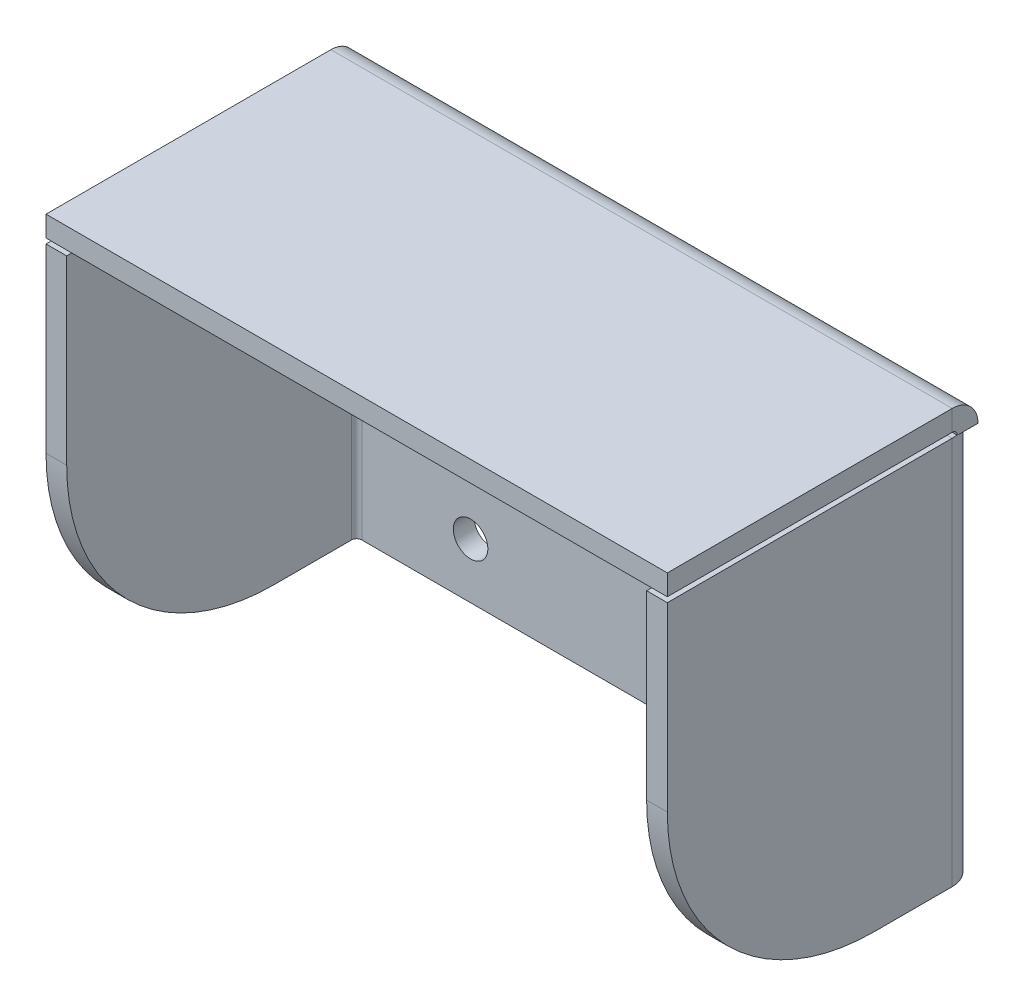
ISO-10303-21;
HEADER;
FILE_DESCRIPTION(('STEP AP214'),'2;1');
FILE_NAME('part.step','',(''),(''),'','','');
FILE_SCHEMA(('AUTOMOTIVE_DESIGN { 1 0 10303 214 1 1 1 1 }'));
ENDSEC;
DATA;
#1=APPLICATION_CONTEXT('core data for automotive mechanical design processes');
#2=APPLICATION_PROTOCOL_DEFINITION('international standard','automotive_design',2000,#1);
#3=PRODUCT_CONTEXT('',#1,'mechanical');
#4=PRODUCT('Part','Part','',(#3));
#5=PRODUCT_RELATED_PRODUCT_CATEGORY('part','',(#4));
#6=PRODUCT_DEFINITION_FORMATION('','',#4);
#7=PRODUCT_DEFINITION_CONTEXT('part definition',#1,'design');
#8=PRODUCT_DEFINITION('design','',#6,#7);
#9=PRODUCT_DEFINITION_SHAPE('','',#8);
#10=(LENGTH_UNIT() NAMED_UNIT(*) SI_UNIT(.MILLI.,.METRE.));
#11=(NAMED_UNIT(*) PLANE_ANGLE_UNIT() SI_UNIT($,.RADIAN.));
#12=(NAMED_UNIT(*) SI_UNIT($,.STERADIAN.) SOLID_ANGLE_UNIT());
#13=UNCERTAINTY_MEASURE_WITH_UNIT(LENGTH_MEASURE(1.E-05),#10,'distance_accuracy_value','');
#14=(GEOMETRIC_REPRESENTATION_CONTEXT(3) GLOBAL_UNCERTAINTY_ASSIGNED_CONTEXT((#13)) GLOBAL_UNIT_ASSIGNED_CONTEXT((#10,
#11,#12)) REPRESENTATION_CONTEXT('',''));
#15=CARTESIAN_POINT('',(0.,0.,0.));
#16=DIRECTION('',(0.,0.,1.));
#17=DIRECTION('',(1.,0.,0.));
#18=AXIS2_PLACEMENT_3D('',#15,#16,#17);
#19=CARTESIAN_POINT('',(45.,26.2634,0.));
#20=DIRECTION('',(0.,-1.,0.));
#21=DIRECTION('',(0.,0.,-1.));
#22=AXIS2_PLACEMENT_3D('',#19,#20,#21);
#23=PLANE('',#22);
#24=DIRECTION('',(-1.,0.,0.));
#25=VECTOR('',#24,1.);
#26=CARTESIAN_POINT('',(45.,26.2634,0.));
#27=LINE('',#26,#25);
#28=CARTESIAN_POINT('',(45.,26.2634,0.));
#29=VERTEX_POINT('',#28);
#30=CARTESIAN_POINT('',(44.926677221287,26.2634,0.));
#31=VERTEX_POINT('',#30);
#32=EDGE_CURVE('E357',#29,#31,#27,.T.);
#33=ORIENTED_EDGE('',*,*,#32,.T.);
#34=CARTESIAN_POINT('',(41.2634,26.2634,0.736599999999992));
#35=DIRECTION('',(0.,1.,0.));
#36=DIRECTION('',(0.,0.,1.));
#37=AXIS2_PLACEMENT_3D('',#34,#35,#36);
#38=CIRCLE('',#37,3.7366);
#39=CARTESIAN_POINT('',(41.2634,26.2634,-3.));
#40=VERTEX_POINT('',#39);
#41=EDGE_CURVE('E296',#31,#40,#38,.T.);
#42=ORIENTED_EDGE('',*,*,#41,.T.);
#43=DIRECTION('',(-1.,0.,0.));
#44=VECTOR('',#43,1.);
#45=CARTESIAN_POINT('',(-45.,26.2634000000001,-3.));
#46=LINE('',#45,#44);
#47=CARTESIAN_POINT('',(45.,26.2634,-3.));
#48=VERTEX_POINT('',#47);
#49=EDGE_CURVE('E360',#48,#40,#46,.T.);
#50=ORIENTED_EDGE('',*,*,#49,.F.);
#51=DIRECTION('',(0.,0.,-1.));
#52=VECTOR('',#51,1.);
#53=CARTESIAN_POINT('',(45.,26.2634,0.));
#54=LINE('',#53,#52);
#55=EDGE_CURVE('E415',#29,#48,#54,.T.);
#56=ORIENTED_EDGE('',*,*,#55,.F.);
#57=EDGE_LOOP('',(#33,#42,#50,#56));
#58=FACE_BOUND('',#57,.T.);
#59=ADVANCED_FACE('F99',(#58),#23,.T.);
#60=CARTESIAN_POINT('',(-41.2634,26.2634,0.));
#61=DIRECTION('',(0.,-1.,0.));
#62=DIRECTION('',(0.,0.,-1.));
#63=AXIS2_PLACEMENT_3D('',#60,#61,#62);
#64=PLANE('',#63);
#65=DIRECTION('',(-1.,0.,0.));
#66=VECTOR('',#65,1.);
#67=CARTESIAN_POINT('',(-45.,26.2634,-3.));
#68=LINE('',#67,#66);
#69=CARTESIAN_POINT('',(-45.,26.2634,-2.99999999999999));
#70=VERTEX_POINT('',#69);
#71=CARTESIAN_POINT('',(-41.2634,26.2634,-2.99999999999998));
#72=VERTEX_POINT('',#71);
#73=EDGE_CURVE('E394',#70,#72,#68,.F.);
#74=ORIENTED_EDGE('',*,*,#73,.T.);
#75=CARTESIAN_POINT('',(-41.2634,26.2634,0.736600000000007));
#76=DIRECTION('',(0.,-1.,0.));
#77=DIRECTION('',(0.,0.,-1.));
#78=AXIS2_PLACEMENT_3D('',#75,#76,#77);
#79=CIRCLE('',#78,3.73659999999999);
#80=CARTESIAN_POINT('',(-44.9266772212869,26.2634,0.));
#81=VERTEX_POINT('',#80);
#82=EDGE_CURVE('E340',#72,#81,#79,.F.);
#83=ORIENTED_EDGE('',*,*,#82,.T.);
#84=DIRECTION('',(-1.,0.,0.));
#85=VECTOR('',#84,1.);
#86=CARTESIAN_POINT('',(-45.,26.2634,0.));
#87=LINE('',#86,#85);
#88=CARTESIAN_POINT('',(-45.,26.2634,0.));
#89=VERTEX_POINT('',#88);
#90=EDGE_CURVE('E408',#89,#81,#87,.F.);
#91=ORIENTED_EDGE('',*,*,#90,.F.);
#92=DIRECTION('',(0.,0.,-1.));
#93=VECTOR('',#92,1.);
#94=CARTESIAN_POINT('',(-45.,26.2634,0.));
#95=LINE('',#94,#93);
#96=EDGE_CURVE('E401',#89,#70,#95,.T.);
#97=ORIENTED_EDGE('',*,*,#96,.T.);
#98=EDGE_LOOP('',(#74,#83,#91,#97));
#99=FACE_BOUND('',#98,.T.);
#100=ADVANCED_FACE('F468',(#99),#64,.T.);
#101=CARTESIAN_POINT('',(0.,0.,-3.));
#102=DIRECTION('',(0.,0.,-1.));
#103=DIRECTION('',(-1.,0.,0.));
#104=AXIS2_PLACEMENT_3D('',#101,#102,#103);
#105=PLANE('',#104);
#106=CARTESIAN_POINT('',(25.5000000000031,13.9999999999997,-3.));
#107=DIRECTION('',(0.,0.,-1.));
#108=DIRECTION('',(-1.,0.,0.));
#109=AXIS2_PLACEMENT_3D('',#106,#107,#108);
#110=CIRCLE('',#109,2.49999999999999);
#111=CARTESIAN_POINT('',(23.0000000000031,13.9999999999997,-3.));
#112=VERTEX_POINT('',#111);
#113=EDGE_CURVE('E432',#112,#112,#110,.T.);
#114=ORIENTED_EDGE('',*,*,#113,.F.);
#115=EDGE_LOOP('',(#114));
#116=FACE_BOUND('',#115,.T.);
#117=CARTESIAN_POINT('',(25.5000000000031,-22.0000000000003,-3.));
#118=DIRECTION('',(0.,0.,-1.));
#119=DIRECTION('',(-1.,0.,0.));
#120=AXIS2_PLACEMENT_3D('',#117,#118,#119);
#121=CIRCLE('',#120,2.49999999999999);
#122=CARTESIAN_POINT('',(23.0000000000031,-22.0000000000003,-3.));
#123=VERTEX_POINT('',#122);
#124=EDGE_CURVE('E431',#123,#123,#121,.T.);
#125=ORIENTED_EDGE('',*,*,#124,.F.);
#126=EDGE_LOOP('',(#125));
#127=FACE_BOUND('',#126,.T.);
#128=CARTESIAN_POINT('',(-25.4999999999969,-22.0000000000003,-3.));
#129=DIRECTION('',(0.,0.,-1.));
#130=DIRECTION('',(-1.,0.,0.));
#131=AXIS2_PLACEMENT_3D('',#128,#129,#130);
#132=CIRCLE('',#131,2.49999999999999);
#133=CARTESIAN_POINT('',(-27.9999999999969,-22.0000000000003,-3.));
#134=VERTEX_POINT('',#133);
#135=EDGE_CURVE('E961',#134,#134,#132,.T.);
#136=ORIENTED_EDGE('',*,*,#135,.F.);
#137=EDGE_LOOP('',(#136));
#138=FACE_BOUND('',#137,.T.);
#139=CARTESIAN_POINT('',(-25.4999999999969,13.9999999999997,-3.));
#140=DIRECTION('',(0.,0.,-1.));
#141=DIRECTION('',(-1.,0.,0.));
#142=AXIS2_PLACEMENT_3D('',#139,#140,#141);
#143=CIRCLE('',#142,2.49999999999999);
#144=CARTESIAN_POINT('',(-27.9999999999969,13.9999999999997,-3.));
#145=VERTEX_POINT('',#144);
#146=EDGE_CURVE('E427',#145,#145,#143,.T.);
#147=ORIENTED_EDGE('',*,*,#146,.F.);
#148=EDGE_LOOP('',(#147));
#149=FACE_BOUND('',#148,.T.);
#150=EDGE_CURVE('E398',#72,#40,#68,.F.);
#151=ORIENTED_EDGE('',*,*,#150,.T.);
#152=DIRECTION('',(0.,1.,0.));
#153=VECTOR('',#152,1.);
#154=CARTESIAN_POINT('',(41.2634,26.2634,-3.00000000000001));
#155=LINE('',#154,#153);
#156=CARTESIAN_POINT('',(41.2634,-30.,-3.));
#157=VERTEX_POINT('',#156);
#158=EDGE_CURVE('E286',#40,#157,#155,.F.);
#159=ORIENTED_EDGE('',*,*,#158,.T.);
#160=DIRECTION('',(1.,0.,0.));
#161=VECTOR('',#160,1.);
#162=CARTESIAN_POINT('',(-45.,-30.,-3.));
#163=LINE('',#162,#161);
#164=CARTESIAN_POINT('',(-41.2634,-30.,-2.99999999999999));
#165=VERTEX_POINT('',#164);
#166=EDGE_CURVE('E420',#165,#157,#163,.T.);
#167=ORIENTED_EDGE('',*,*,#166,.F.);
#168=DIRECTION('',(0.,-1.,0.));
#169=VECTOR('',#168,1.);
#170=CARTESIAN_POINT('',(-41.2634,-30.,-2.99999999999999));
#171=LINE('',#170,#169);
#172=EDGE_CURVE('E335',#165,#72,#171,.F.);
#173=ORIENTED_EDGE('',*,*,#172,.T.);
#174=EDGE_LOOP('',(#151,#159,#167,#173));
#175=FACE_BOUND('',#174,.T.);
#176=ADVANCED_FACE('F474',(#116,#127,#138,#149,#175),#105,.T.);
#177=CARTESIAN_POINT('',(0.,0.,0.));
#178=DIRECTION('',(0.,0.,-1.));
#179=DIRECTION('',(-1.,0.,0.));
#180=AXIS2_PLACEMENT_3D('',#177,#178,#179);
#181=PLANE('',#180);
#182=CARTESIAN_POINT('',(25.5000000000031,13.9999999999997,0.));
#183=DIRECTION('',(0.,0.,-1.));
#184=DIRECTION('',(-1.,0.,0.));
#185=AXIS2_PLACEMENT_3D('',#182,#183,#184);
#186=CIRCLE('',#185,2.49999999999999);
#187=CARTESIAN_POINT('',(23.0000000000031,13.9999999999997,0.));
#188=VERTEX_POINT('',#187);
#189=EDGE_CURVE('E428',#188,#188,#186,.T.);
#190=ORIENTED_EDGE('',*,*,#189,.T.);
#191=EDGE_LOOP('',(#190));
#192=FACE_BOUND('',#191,.T.);
#193=CARTESIAN_POINT('',(25.5000000000031,-22.0000000000003,0.));
#194=DIRECTION('',(0.,0.,-1.));
#195=DIRECTION('',(-1.,0.,0.));
#196=AXIS2_PLACEMENT_3D('',#193,#194,#195);
#197=CIRCLE('',#196,2.49999999999999);
#198=CARTESIAN_POINT('',(23.0000000000031,-22.0000000000003,0.));
#199=VERTEX_POINT('',#198);
#200=EDGE_CURVE('E953',#199,#199,#197,.T.);
#201=ORIENTED_EDGE('',*,*,#200,.T.);
#202=EDGE_LOOP('',(#201));
#203=FACE_BOUND('',#202,.T.);
#204=CARTESIAN_POINT('',(-25.4999999999969,-22.0000000000003,0.));
#205=DIRECTION('',(0.,0.,-1.));
#206=DIRECTION('',(-1.,0.,0.));
#207=AXIS2_PLACEMENT_3D('',#204,#205,#206);
#208=CIRCLE('',#207,2.49999999999999);
#209=CARTESIAN_POINT('',(-27.9999999999969,-22.0000000000003,0.));
#210=VERTEX_POINT('',#209);
#211=EDGE_CURVE('E957',#210,#210,#208,.T.);
#212=ORIENTED_EDGE('',*,*,#211,.T.);
#213=EDGE_LOOP('',(#212));
#214=FACE_BOUND('',#213,.T.);
#215=CARTESIAN_POINT('',(-25.4999999999969,13.9999999999997,0.));
#216=DIRECTION('',(0.,0.,-1.));
#217=DIRECTION('',(-1.,0.,0.));
#218=AXIS2_PLACEMENT_3D('',#215,#216,#217);
#219=CIRCLE('',#218,2.49999999999999);
#220=CARTESIAN_POINT('',(-27.9999999999969,13.9999999999997,0.));
#221=VERTEX_POINT('',#220);
#222=EDGE_CURVE('E285',#221,#221,#219,.T.);
#223=ORIENTED_EDGE('',*,*,#222,.T.);
#224=EDGE_LOOP('',(#223));
#225=FACE_BOUND('',#224,.T.);
#226=DIRECTION('',(0.,1.,0.));
#227=VECTOR('',#226,1.);
#228=CARTESIAN_POINT('',(41.2634,26.2634,0.));
#229=LINE('',#228,#227);
#230=CARTESIAN_POINT('',(41.2634,26.2634,0.));
#231=VERTEX_POINT('',#230);
#232=CARTESIAN_POINT('',(41.2634,-30.,0.));
#233=VERTEX_POINT('',#232);
#234=EDGE_CURVE('E299',#231,#233,#229,.F.);
#235=ORIENTED_EDGE('',*,*,#234,.F.);
#236=CARTESIAN_POINT('',(-41.2634,26.2634,0.));
#237=VERTEX_POINT('',#236);
#238=EDGE_CURVE('E412',#237,#231,#87,.F.);
#239=ORIENTED_EDGE('',*,*,#238,.F.);
#240=DIRECTION('',(0.,-1.,0.));
#241=VECTOR('',#240,1.);
#242=CARTESIAN_POINT('',(-41.2634,-30.,0.));
#243=LINE('',#242,#241);
#244=CARTESIAN_POINT('',(-41.2634,-30.,0.));
#245=VERTEX_POINT('',#244);
#246=EDGE_CURVE('E349',#245,#237,#243,.F.);
#247=ORIENTED_EDGE('',*,*,#246,.F.);
#248=DIRECTION('',(1.,0.,0.));
#249=VECTOR('',#248,1.);
#250=CARTESIAN_POINT('',(-45.,-30.,0.));
#251=LINE('',#250,#249);
#252=EDGE_CURVE('E418',#245,#233,#251,.T.);
#253=ORIENTED_EDGE('',*,*,#252,.T.);
#254=EDGE_LOOP('',(#235,#239,#247,#253));
#255=FACE_BOUND('',#254,.T.);
#256=ADVANCED_FACE('F521',(#192,#203,#214,#225,#255),#181,.F.);
#257=CARTESIAN_POINT('',(-45.,-30.,-3.));
#258=DIRECTION('',(0.,-1.,0.));
#259=DIRECTION('',(0.,0.,-1.));
#260=AXIS2_PLACEMENT_3D('',#257,#258,#259);
#261=PLANE('',#260);
#262=DIRECTION('',(0.,0.,-1.));
#263=VECTOR('',#262,1.);
#264=CARTESIAN_POINT('',(41.2634,-30.,0.));
#265=LINE('',#264,#263);
#266=EDGE_CURVE('E292',#233,#157,#265,.T.);
#267=ORIENTED_EDGE('',*,*,#266,.F.);
#268=ORIENTED_EDGE('',*,*,#252,.F.);
#269=DIRECTION('',(0.,0.,-1.));
#270=VECTOR('',#269,1.);
#271=CARTESIAN_POINT('',(-41.2634,-30.,0.));
#272=LINE('',#271,#270);
#273=EDGE_CURVE('E343',#245,#165,#272,.T.);
#274=ORIENTED_EDGE('',*,*,#273,.T.);
#275=ORIENTED_EDGE('',*,*,#166,.T.);
#276=EDGE_LOOP('',(#267,#268,#274,#275));
#277=FACE_BOUND('',#276,.T.);
#278=ADVANCED_FACE('F514',(#277),#261,.T.);
#279=CARTESIAN_POINT('',(45.,26.2634,0.736599999999998));
#280=DIRECTION('',(1.,0.,0.));
#281=DIRECTION('',(0.,0.,-1.));
#282=AXIS2_PLACEMENT_3D('',#279,#280,#281);
#283=PLANE('',#282);
#284=DIRECTION('',(0.,-1.,0.));
#285=VECTOR('',#284,1.);
#286=CARTESIAN_POINT('',(45.,30.,0.736599999999986));
#287=LINE('',#286,#285);
#288=CARTESIAN_POINT('',(45.,27.,0.736599999999995));
#289=VERTEX_POINT('',#288);
#290=CARTESIAN_POINT('',(45.,30.,0.736599999999985));
#291=VERTEX_POINT('',#290);
#292=EDGE_CURVE('E363',#289,#291,#287,.F.);
#293=ORIENTED_EDGE('',*,*,#292,.F.);
#294=CARTESIAN_POINT('',(45.,26.2634,0.736599999999998));
#295=DIRECTION('',(-1.,0.,0.));
#296=DIRECTION('',(0.,0.,1.));
#297=AXIS2_PLACEMENT_3D('',#294,#295,#296);
#298=CIRCLE('',#297,0.7366);
#299=EDGE_CURVE('E405',#29,#289,#298,.F.);
#300=ORIENTED_EDGE('',*,*,#299,.F.);
#301=ORIENTED_EDGE('',*,*,#55,.T.);
#302=CARTESIAN_POINT('',(45.,26.2634,0.736599999999998));
#303=DIRECTION('',(-1.,0.,0.));
#304=DIRECTION('',(0.,0.,1.));
#305=AXIS2_PLACEMENT_3D('',#302,#303,#304);
#306=CIRCLE('',#305,3.7366);
#307=EDGE_CURVE('E397',#48,#291,#306,.F.);
#308=ORIENTED_EDGE('',*,*,#307,.T.);
#309=EDGE_LOOP('',(#293,#300,#301,#308));
#310=FACE_BOUND('',#309,.T.);
#311=ADVANCED_FACE('F511',(#310),#283,.T.);
#312=CARTESIAN_POINT('',(-45.,26.2634,0.736600000000005));
#313=DIRECTION('',(1.,0.,0.));
#314=DIRECTION('',(0.,0.,-1.));
#315=AXIS2_PLACEMENT_3D('',#312,#313,#314);
#316=PLANE('',#315);
#317=CARTESIAN_POINT('',(-45.,26.2634,0.736600000000005));
#318=DIRECTION('',(-1.,0.,0.));
#319=DIRECTION('',(0.,0.,1.));
#320=AXIS2_PLACEMENT_3D('',#317,#318,#319);
#321=CIRCLE('',#320,0.7366);
#322=CARTESIAN_POINT('',(-45.,27.,0.736600000000002));
#323=VERTEX_POINT('',#322);
#324=EDGE_CURVE('E367',#323,#89,#321,.T.);
#325=ORIENTED_EDGE('',*,*,#324,.F.);
#326=DIRECTION('',(0.,-1.,0.));
#327=VECTOR('',#326,1.);
#328=CARTESIAN_POINT('',(-45.,27.,0.7366));
#329=LINE('',#328,#327);
#330=CARTESIAN_POINT('',(-45.,30.,0.73659999999999));
#331=VERTEX_POINT('',#330);
#332=EDGE_CURVE('E387',#323,#331,#329,.F.);
#333=ORIENTED_EDGE('',*,*,#332,.T.);
#334=CARTESIAN_POINT('',(-45.,26.2634,0.736600000000005));
#335=DIRECTION('',(-1.,0.,0.));
#336=DIRECTION('',(0.,0.,1.));
#337=AXIS2_PLACEMENT_3D('',#334,#335,#336);
#338=CIRCLE('',#337,3.7366);
#339=EDGE_CURVE('E402',#331,#70,#338,.T.);
#340=ORIENTED_EDGE('',*,*,#339,.T.);
#341=ORIENTED_EDGE('',*,*,#96,.F.);
#342=EDGE_LOOP('',(#325,#333,#340,#341));
#343=FACE_BOUND('',#342,.T.);
#344=ADVANCED_FACE('F506',(#343),#316,.F.);
#345=CARTESIAN_POINT('',(-45.,26.2634,0.736600000000005));
#346=DIRECTION('',(-1.,0.,0.));
#347=DIRECTION('',(0.,1.,0.));
#348=AXIS2_PLACEMENT_3D('',#345,#346,#347);
#349=CYLINDRICAL_SURFACE('',#348,3.7366);
#350=ORIENTED_EDGE('',*,*,#73,.F.);
#351=ORIENTED_EDGE('',*,*,#339,.F.);
#352=DIRECTION('',(-1.,0.,0.));
#353=VECTOR('',#352,1.);
#354=CARTESIAN_POINT('',(45.,30.,0.736599999999986));
#355=LINE('',#354,#353);
#356=EDGE_CURVE('E385',#331,#291,#355,.F.);
#357=ORIENTED_EDGE('',*,*,#356,.T.);
#358=ORIENTED_EDGE('',*,*,#307,.F.);
#359=ORIENTED_EDGE('',*,*,#49,.T.);
#360=ORIENTED_EDGE('',*,*,#150,.F.);
#361=EDGE_LOOP('',(#350,#351,#357,#358,#359,#360));
#362=FACE_BOUND('',#361,.T.);
#363=ADVANCED_FACE('F503',(#362),#349,.T.);
#364=CARTESIAN_POINT('',(-45.,26.2634,0.736600000000005));
#365=DIRECTION('',(-1.,0.,0.));
#366=DIRECTION('',(0.,1.,0.));
#367=AXIS2_PLACEMENT_3D('',#364,#365,#366);
#368=CYLINDRICAL_SURFACE('',#367,0.7366);
#369=ORIENTED_EDGE('',*,*,#90,.T.);
#370=EDGE_CURVE('E411',#81,#237,#87,.F.);
#371=ORIENTED_EDGE('',*,*,#370,.T.);
#372=ORIENTED_EDGE('',*,*,#238,.T.);
#373=EDGE_CURVE('E356',#31,#231,#27,.T.);
#374=ORIENTED_EDGE('',*,*,#373,.F.);
#375=ORIENTED_EDGE('',*,*,#32,.F.);
#376=ORIENTED_EDGE('',*,*,#299,.T.);
#377=DIRECTION('',(-1.,0.,0.));
#378=VECTOR('',#377,1.);
#379=CARTESIAN_POINT('',(45.,27.,0.736599999999997));
#380=LINE('',#379,#378);
#381=EDGE_CURVE('E390',#289,#323,#380,.T.);
#382=ORIENTED_EDGE('',*,*,#381,.T.);
#383=ORIENTED_EDGE('',*,*,#324,.T.);
#384=EDGE_LOOP('',(#369,#371,#372,#374,#375,#376,#382,#383));
#385=FACE_BOUND('',#384,.T.);
#386=ADVANCED_FACE('F501',(#385),#368,.F.);
#387=CARTESIAN_POINT('',(45.,30.,0.));
#388=DIRECTION('',(-1.,0.,0.));
#389=DIRECTION('',(0.,0.,1.));
#390=AXIS2_PLACEMENT_3D('',#387,#388,#389);
#391=PLANE('',#390);
#392=ORIENTED_EDGE('',*,*,#292,.T.);
#393=DIRECTION('',(0.,0.,-1.));
#394=VECTOR('',#393,1.);
#395=CARTESIAN_POINT('',(45.,30.,-1.14557852575138E-13));
#396=LINE('',#395,#394);
#397=CARTESIAN_POINT('',(45.,30.0000000000001,42.));
#398=VERTEX_POINT('',#397);
#399=EDGE_CURVE('E375',#398,#291,#396,.T.);
#400=ORIENTED_EDGE('',*,*,#399,.F.);
#401=DIRECTION('',(0.,-1.,0.));
#402=VECTOR('',#401,1.);
#403=CARTESIAN_POINT('',(45.,30.0000000000001,42.));
#404=LINE('',#403,#402);
#405=CARTESIAN_POINT('',(45.,27.0000000000001,42.));
#406=VERTEX_POINT('',#405);
#407=EDGE_CURVE('E368',#398,#406,#404,.T.);
#408=ORIENTED_EDGE('',*,*,#407,.T.);
#409=DIRECTION('',(0.,0.,1.));
#410=VECTOR('',#409,1.);
#411=CARTESIAN_POINT('',(45.,27.,0.));
#412=LINE('',#411,#410);
#413=EDGE_CURVE('E382',#406,#289,#412,.F.);
#414=ORIENTED_EDGE('',*,*,#413,.T.);
#415=EDGE_LOOP('',(#392,#400,#408,#414));
#416=FACE_BOUND('',#415,.T.);
#417=ADVANCED_FACE('F497',(#416),#391,.F.);
#418=CARTESIAN_POINT('',(-45.,30.0000000000001,42.));
#419=DIRECTION('',(1.,0.,0.));
#420=DIRECTION('',(0.,0.,-1.));
#421=AXIS2_PLACEMENT_3D('',#418,#419,#420);
#422=PLANE('',#421);
#423=ORIENTED_EDGE('',*,*,#332,.F.);
#424=DIRECTION('',(0.,0.,-1.));
#425=VECTOR('',#424,1.);
#426=CARTESIAN_POINT('',(-45.,27.0000000000001,42.));
#427=LINE('',#426,#425);
#428=CARTESIAN_POINT('',(-45.,27.0000000000001,42.));
#429=VERTEX_POINT('',#428);
#430=EDGE_CURVE('E380',#323,#429,#427,.F.);
#431=ORIENTED_EDGE('',*,*,#430,.T.);
#432=DIRECTION('',(0.,-1.,0.));
#433=VECTOR('',#432,1.);
#434=CARTESIAN_POINT('',(-45.,30.0000000000001,42.));
#435=LINE('',#434,#433);
#436=CARTESIAN_POINT('',(-45.,30.0000000000001,42.));
#437=VERTEX_POINT('',#436);
#438=EDGE_CURVE('E364',#437,#429,#435,.T.);
#439=ORIENTED_EDGE('',*,*,#438,.F.);
#440=DIRECTION('',(0.,0.,1.));
#441=VECTOR('',#440,1.);
#442=CARTESIAN_POINT('',(-45.,30.,-1.0712332339238E-13));
#443=LINE('',#442,#441);
#444=EDGE_CURVE('E373',#331,#437,#443,.T.);
#445=ORIENTED_EDGE('',*,*,#444,.F.);
#446=EDGE_LOOP('',(#423,#431,#439,#445));
#447=FACE_BOUND('',#446,.T.);
#448=ADVANCED_FACE('F485',(#447),#422,.F.);
#449=CARTESIAN_POINT('',(0.,30.,-1.14557852575138E-13));
#450=DIRECTION('',(0.,-1.,0.));
#451=DIRECTION('',(0.,0.,-1.));
#452=AXIS2_PLACEMENT_3D('',#449,#450,#451);
#453=PLANE('',#452);
#454=ORIENTED_EDGE('',*,*,#356,.F.);
#455=ORIENTED_EDGE('',*,*,#444,.T.);
#456=DIRECTION('',(1.,0.,0.));
#457=VECTOR('',#456,1.);
#458=CARTESIAN_POINT('',(0.,30.0000000000001,42.));
#459=LINE('',#458,#457);
#460=EDGE_CURVE('E371',#437,#398,#459,.T.);
#461=ORIENTED_EDGE('',*,*,#460,.T.);
#462=ORIENTED_EDGE('',*,*,#399,.T.);
#463=EDGE_LOOP('',(#454,#455,#461,#462));
#464=FACE_BOUND('',#463,.T.);
#465=ADVANCED_FACE('F481',(#464),#453,.F.);
#466=CARTESIAN_POINT('',(0.,27.,-1.04083408558608E-13));
#467=DIRECTION('',(0.,-1.,0.));
#468=DIRECTION('',(0.,0.,-1.));
#469=AXIS2_PLACEMENT_3D('',#466,#467,#468);
#470=PLANE('',#469);
#471=ORIENTED_EDGE('',*,*,#430,.F.);
#472=ORIENTED_EDGE('',*,*,#381,.F.);
#473=ORIENTED_EDGE('',*,*,#413,.F.);
#474=DIRECTION('',(-1.,0.,0.));
#475=VECTOR('',#474,1.);
#476=CARTESIAN_POINT('',(45.,27.0000000000001,42.));
#477=LINE('',#476,#475);
#478=EDGE_CURVE('E378',#429,#406,#477,.F.);
#479=ORIENTED_EDGE('',*,*,#478,.F.);
#480=EDGE_LOOP('',(#471,#472,#473,#479));
#481=FACE_BOUND('',#480,.T.);
#482=ADVANCED_FACE('F484',(#481),#470,.T.);
#483=CARTESIAN_POINT('',(45.,30.0000000000001,42.));
#484=DIRECTION('',(0.,0.,-1.));
#485=DIRECTION('',(0.,1.,0.));
#486=AXIS2_PLACEMENT_3D('',#483,#484,#485);
#487=PLANE('',#486);
#488=ORIENTED_EDGE('',*,*,#478,.T.);
#489=ORIENTED_EDGE('',*,*,#407,.F.);
#490=ORIENTED_EDGE('',*,*,#460,.F.);
#491=ORIENTED_EDGE('',*,*,#438,.T.);
#492=EDGE_LOOP('',(#488,#489,#490,#491));
#493=FACE_BOUND('',#492,.T.);
#494=ADVANCED_FACE('F489',(#493),#487,.F.);
#495=CARTESIAN_POINT('',(-41.2634,26.2634,0.736600000000007));
#496=DIRECTION('',(0.,1.,0.));
#497=DIRECTION('',(0.,0.,1.));
#498=AXIS2_PLACEMENT_3D('',#495,#496,#497);
#499=PLANE('',#498);
#500=ORIENTED_EDGE('',*,*,#370,.F.);
#501=CARTESIAN_POINT('',(-45.,26.2634,0.736599999999994));
#502=VERTEX_POINT('',#501);
#503=EDGE_CURVE('E338',#81,#502,#79,.F.);
#504=ORIENTED_EDGE('',*,*,#503,.T.);
#505=DIRECTION('',(1.,0.,0.));
#506=VECTOR('',#505,1.);
#507=CARTESIAN_POINT('',(-45.,26.2634,0.736599999999993));
#508=LINE('',#507,#506);
#509=CARTESIAN_POINT('',(-42.,26.2634,0.736600000000005));
#510=VERTEX_POINT('',#509);
#511=EDGE_CURVE('E306',#510,#502,#508,.F.);
#512=ORIENTED_EDGE('',*,*,#511,.F.);
#513=CARTESIAN_POINT('',(-41.2634,26.2634,0.736600000000007));
#514=DIRECTION('',(0.,-1.,0.));
#515=DIRECTION('',(0.,0.,-1.));
#516=AXIS2_PLACEMENT_3D('',#513,#514,#515);
#517=CIRCLE('',#516,0.73659999999999);
#518=EDGE_CURVE('E346',#237,#510,#517,.F.);
#519=ORIENTED_EDGE('',*,*,#518,.F.);
#520=EDGE_LOOP('',(#500,#504,#512,#519));
#521=FACE_BOUND('',#520,.T.);
#522=ADVANCED_FACE('F493',(#521),#499,.T.);
#523=CARTESIAN_POINT('',(-41.2634,-30.,0.736599999999999));
#524=DIRECTION('',(0.,1.,0.));
#525=DIRECTION('',(0.,0.,1.));
#526=AXIS2_PLACEMENT_3D('',#523,#524,#525);
#527=PLANE('',#526);
#528=CARTESIAN_POINT('',(-41.2634,-30.,0.736599999999999));
#529=DIRECTION('',(0.,-1.,0.));
#530=DIRECTION('',(0.,0.,-1.));
#531=AXIS2_PLACEMENT_3D('',#528,#529,#530);
#532=CIRCLE('',#531,0.73659999999999);
#533=CARTESIAN_POINT('',(-42.,-30.,0.736599999999996));
#534=VERTEX_POINT('',#533);
#535=EDGE_CURVE('E310',#534,#245,#532,.T.);
#536=ORIENTED_EDGE('',*,*,#535,.F.);
#537=DIRECTION('',(1.,0.,0.));
#538=VECTOR('',#537,1.);
#539=CARTESIAN_POINT('',(-42.,-30.,0.736599999999997));
#540=LINE('',#539,#538);
#541=CARTESIAN_POINT('',(-45.,-30.,0.736599999999986));
#542=VERTEX_POINT('',#541);
#543=EDGE_CURVE('E328',#534,#542,#540,.F.);
#544=ORIENTED_EDGE('',*,*,#543,.T.);
#545=CARTESIAN_POINT('',(-41.2634,-30.,0.736599999999999));
#546=DIRECTION('',(0.,-1.,0.));
#547=DIRECTION('',(0.,0.,-1.));
#548=AXIS2_PLACEMENT_3D('',#545,#546,#547);
#549=CIRCLE('',#548,3.73659999999999);
#550=EDGE_CURVE('E339',#542,#165,#549,.T.);
#551=ORIENTED_EDGE('',*,*,#550,.T.);
#552=ORIENTED_EDGE('',*,*,#273,.F.);
#553=EDGE_LOOP('',(#536,#544,#551,#552));
#554=FACE_BOUND('',#553,.T.);
#555=ADVANCED_FACE('F478',(#554),#527,.F.);
#556=CARTESIAN_POINT('',(-41.2634,-30.,0.736599999999999));
#557=DIRECTION('',(0.,-1.,0.));
#558=DIRECTION('',(-1.,0.,0.));
#559=AXIS2_PLACEMENT_3D('',#556,#557,#558);
#560=CYLINDRICAL_SURFACE('',#559,3.73659999999999);
#561=ORIENTED_EDGE('',*,*,#172,.F.);
#562=ORIENTED_EDGE('',*,*,#550,.F.);
#563=DIRECTION('',(0.,-1.,0.));
#564=VECTOR('',#563,1.);
#565=CARTESIAN_POINT('',(-45.,26.2634,0.736599999999993));
#566=LINE('',#565,#564);
#567=EDGE_CURVE('E325',#542,#502,#566,.F.);
#568=ORIENTED_EDGE('',*,*,#567,.T.);
#569=ORIENTED_EDGE('',*,*,#503,.F.);
#570=ORIENTED_EDGE('',*,*,#82,.F.);
#571=EDGE_LOOP('',(#561,#562,#568,#569,#570));
#572=FACE_BOUND('',#571,.T.);
#573=ADVANCED_FACE('F582',(#572),#560,.T.);
#574=CARTESIAN_POINT('',(-41.2634,-30.,0.736599999999999));
#575=DIRECTION('',(0.,-1.,0.));
#576=DIRECTION('',(-1.,0.,0.));
#577=AXIS2_PLACEMENT_3D('',#574,#575,#576);
#578=CYLINDRICAL_SURFACE('',#577,0.73659999999999);
#579=ORIENTED_EDGE('',*,*,#246,.T.);
#580=ORIENTED_EDGE('',*,*,#518,.T.);
#581=DIRECTION('',(0.,-1.,0.));
#582=VECTOR('',#581,1.);
#583=CARTESIAN_POINT('',(-42.,26.2634,0.736600000000004));
#584=LINE('',#583,#582);
#585=EDGE_CURVE('E331',#510,#534,#584,.T.);
#586=ORIENTED_EDGE('',*,*,#585,.T.);
#587=ORIENTED_EDGE('',*,*,#535,.T.);
#588=EDGE_LOOP('',(#579,#580,#586,#587));
#589=FACE_BOUND('',#588,.T.);
#590=ADVANCED_FACE('F585',(#589),#578,.F.);
#591=CARTESIAN_POINT('',(-45.0000000000001,-30.,42.));
#592=DIRECTION('',(0.,1.,0.));
#593=DIRECTION('',(-1.,0.,0.));
#594=AXIS2_PLACEMENT_3D('',#591,#592,#593);
#595=PLANE('',#594);
#596=DIRECTION('',(0.,0.,-1.));
#597=VECTOR('',#596,1.);
#598=CARTESIAN_POINT('',(-42.0000000000001,-30.,42.));
#599=LINE('',#598,#597);
#600=CARTESIAN_POINT('',(-42.,-30.,12.));
#601=VERTEX_POINT('',#600);
#602=EDGE_CURVE('E323',#534,#601,#599,.F.);
#603=ORIENTED_EDGE('',*,*,#602,.T.);
#604=DIRECTION('',(1.,0.,0.));
#605=VECTOR('',#604,1.);
#606=CARTESIAN_POINT('',(-45.,-30.,12.));
#607=LINE('',#606,#605);
#608=CARTESIAN_POINT('',(-45.,-30.,12.));
#609=VERTEX_POINT('',#608);
#610=EDGE_CURVE('E107',#601,#609,#607,.F.);
#611=ORIENTED_EDGE('',*,*,#610,.T.);
#612=DIRECTION('',(0.,0.,1.));
#613=VECTOR('',#612,1.);
#614=CARTESIAN_POINT('',(-45.,-30.,-1.61643204065937E-13));
#615=LINE('',#614,#613);
#616=EDGE_CURVE('E316',#542,#609,#615,.T.);
#617=ORIENTED_EDGE('',*,*,#616,.F.);
#618=ORIENTED_EDGE('',*,*,#543,.F.);
#619=EDGE_LOOP('',(#603,#611,#617,#618));
#620=FACE_BOUND('',#619,.T.);
#621=ADVANCED_FACE('F589',(#620),#595,.F.);
#622=CARTESIAN_POINT('',(-45.,26.2634,0.));
#623=DIRECTION('',(0.,-1.,0.));
#624=DIRECTION('',(1.,0.,0.));
#625=AXIS2_PLACEMENT_3D('',#622,#623,#624);
#626=PLANE('',#625);
#627=ORIENTED_EDGE('',*,*,#511,.T.);
#628=DIRECTION('',(0.,0.,-1.));
#629=VECTOR('',#628,1.);
#630=CARTESIAN_POINT('',(-45.,26.2634,-1.68769068118202E-13));
#631=LINE('',#630,#629);
#632=CARTESIAN_POINT('',(-45.0000000000001,26.2634,42.));
#633=VERTEX_POINT('',#632);
#634=EDGE_CURVE('E311',#633,#502,#631,.T.);
#635=ORIENTED_EDGE('',*,*,#634,.F.);
#636=DIRECTION('',(1.,0.,0.));
#637=VECTOR('',#636,1.);
#638=CARTESIAN_POINT('',(-45.0000000000001,26.2634,42.));
#639=LINE('',#638,#637);
#640=CARTESIAN_POINT('',(-42.0000000000001,26.2634,42.));
#641=VERTEX_POINT('',#640);
#642=EDGE_CURVE('E307',#633,#641,#639,.T.);
#643=ORIENTED_EDGE('',*,*,#642,.T.);
#644=DIRECTION('',(0.,0.,1.));
#645=VECTOR('',#644,1.);
#646=CARTESIAN_POINT('',(-42.,26.2634,0.));
#647=LINE('',#646,#645);
#648=EDGE_CURVE('E318',#641,#510,#647,.F.);
#649=ORIENTED_EDGE('',*,*,#648,.T.);
#650=EDGE_LOOP('',(#627,#635,#643,#649));
#651=FACE_BOUND('',#650,.T.);
#652=ADVANCED_FACE('F455',(#651),#626,.F.);
#653=CARTESIAN_POINT('',(-45.,0.,-1.66599556854442E-13));
#654=DIRECTION('',(1.,0.,0.));
#655=DIRECTION('',(0.,0.,-1.));
#656=AXIS2_PLACEMENT_3D('',#653,#654,#655);
#657=PLANE('',#656);
#658=ORIENTED_EDGE('',*,*,#616,.T.);
#659=CARTESIAN_POINT('',(-45.,0.,12.));
#660=DIRECTION('',(1.,0.,0.));
#661=DIRECTION('',(0.,0.,-1.));
#662=AXIS2_PLACEMENT_3D('',#659,#660,#661);
#663=CIRCLE('',#662,30.);
#664=CARTESIAN_POINT('',(-45.0000000000001,0.,42.));
#665=VERTEX_POINT('',#664);
#666=EDGE_CURVE('E13',#609,#665,#663,.F.);
#667=ORIENTED_EDGE('',*,*,#666,.T.);
#668=DIRECTION('',(0.,1.,0.));
#669=VECTOR('',#668,1.);
#670=CARTESIAN_POINT('',(-45.0000000000001,0.,42.));
#671=LINE('',#670,#669);
#672=EDGE_CURVE('E314',#665,#633,#671,.T.);
#673=ORIENTED_EDGE('',*,*,#672,.T.);
#674=ORIENTED_EDGE('',*,*,#634,.T.);
#675=ORIENTED_EDGE('',*,*,#567,.F.);
#676=EDGE_LOOP('',(#658,#667,#673,#674,#675));
#677=FACE_BOUND('',#676,.T.);
#678=ADVANCED_FACE('F459',(#677),#657,.F.);
#679=CARTESIAN_POINT('',(-42.,0.,-1.56125112837913E-13));
#680=DIRECTION('',(1.,0.,0.));
#681=DIRECTION('',(0.,0.,-1.));
#682=AXIS2_PLACEMENT_3D('',#679,#680,#681);
#683=PLANE('',#682);
#684=DIRECTION('',(0.,-1.,0.));
#685=VECTOR('',#684,1.);
#686=CARTESIAN_POINT('',(-42.0000000000001,26.2634,42.));
#687=LINE('',#686,#685);
#688=CARTESIAN_POINT('',(-42.0000000000001,0.,42.));
#689=VERTEX_POINT('',#688);
#690=EDGE_CURVE('E321',#689,#641,#687,.F.);
#691=ORIENTED_EDGE('',*,*,#690,.F.);
#692=CARTESIAN_POINT('',(-42.,0.,12.));
#693=DIRECTION('',(1.,0.,0.));
#694=DIRECTION('',(0.,0.,-1.));
#695=AXIS2_PLACEMENT_3D('',#692,#693,#694);
#696=CIRCLE('',#695,30.);
#697=EDGE_CURVE('E121',#689,#601,#696,.T.);
#698=ORIENTED_EDGE('',*,*,#697,.T.);
#699=ORIENTED_EDGE('',*,*,#602,.F.);
#700=ORIENTED_EDGE('',*,*,#585,.F.);
#701=ORIENTED_EDGE('',*,*,#648,.F.);
#702=EDGE_LOOP('',(#691,#698,#699,#700,#701));
#703=FACE_BOUND('',#702,.T.);
#704=ADVANCED_FACE('F452',(#703),#683,.T.);
#705=CARTESIAN_POINT('',(-45.0000000000001,26.2634,42.));
#706=DIRECTION('',(0.,0.,-1.));
#707=DIRECTION('',(-1.,0.,0.));
#708=AXIS2_PLACEMENT_3D('',#705,#706,#707);
#709=PLANE('',#708);
#710=ORIENTED_EDGE('',*,*,#672,.F.);
#711=DIRECTION('',(1.,0.,0.));
#712=VECTOR('',#711,1.);
#713=CARTESIAN_POINT('',(-45.0000000000001,0.,42.));
#714=LINE('',#713,#712);
#715=EDGE_CURVE('E441',#665,#689,#714,.T.);
#716=ORIENTED_EDGE('',*,*,#715,.T.);
#717=ORIENTED_EDGE('',*,*,#690,.T.);
#718=ORIENTED_EDGE('',*,*,#642,.F.);
#719=EDGE_LOOP('',(#710,#716,#717,#718));
#720=FACE_BOUND('',#719,.T.);
#721=ADVANCED_FACE('F447',(#720),#709,.F.);
#722=CARTESIAN_POINT('',(41.2634,-30.,0.7366));
#723=DIRECTION('',(0.,-1.,0.));
#724=DIRECTION('',(0.,0.,-1.));
#725=AXIS2_PLACEMENT_3D('',#722,#723,#724);
#726=PLANE('',#725);
#727=DIRECTION('',(-1.,0.,0.));
#728=VECTOR('',#727,1.);
#729=CARTESIAN_POINT('',(45.,-30.,0.736599999999986));
#730=LINE('',#729,#728);
#731=CARTESIAN_POINT('',(42.,-30.,0.736599999999998));
#732=VERTEX_POINT('',#731);
#733=CARTESIAN_POINT('',(45.,-30.,0.736599999999987));
#734=VERTEX_POINT('',#733);
#735=EDGE_CURVE('E282',#732,#734,#730,.F.);
#736=ORIENTED_EDGE('',*,*,#735,.F.);
#737=CARTESIAN_POINT('',(41.2634,-30.,0.7366));
#738=DIRECTION('',(0.,1.,0.));
#739=DIRECTION('',(0.,0.,1.));
#740=AXIS2_PLACEMENT_3D('',#737,#738,#739);
#741=CIRCLE('',#740,0.736599999999997);
#742=EDGE_CURVE('E295',#233,#732,#741,.F.);
#743=ORIENTED_EDGE('',*,*,#742,.F.);
#744=ORIENTED_EDGE('',*,*,#266,.T.);
#745=CARTESIAN_POINT('',(41.2634,-30.,0.7366));
#746=DIRECTION('',(0.,1.,0.));
#747=DIRECTION('',(0.,0.,1.));
#748=AXIS2_PLACEMENT_3D('',#745,#746,#747);
#749=CIRCLE('',#748,3.7366);
#750=EDGE_CURVE('E288',#157,#734,#749,.F.);
#751=ORIENTED_EDGE('',*,*,#750,.T.);
#752=EDGE_LOOP('',(#736,#743,#744,#751));
#753=FACE_BOUND('',#752,.T.);
#754=ADVANCED_FACE('F545',(#753),#726,.T.);
#755=CARTESIAN_POINT('',(41.2634,26.2634,0.736599999999992));
#756=DIRECTION('',(0.,-1.,0.));
#757=DIRECTION('',(0.,0.,-1.));
#758=AXIS2_PLACEMENT_3D('',#755,#756,#757);
#759=PLANE('',#758);
#760=CARTESIAN_POINT('',(45.,26.2634,0.736599999999979));
#761=VERTEX_POINT('',#760);
#762=EDGE_CURVE('E289',#761,#31,#38,.T.);
#763=ORIENTED_EDGE('',*,*,#762,.T.);
#764=ORIENTED_EDGE('',*,*,#373,.T.);
#765=CARTESIAN_POINT('',(41.2634,26.2634,0.736599999999992));
#766=DIRECTION('',(0.,1.,0.));
#767=DIRECTION('',(0.,0.,1.));
#768=AXIS2_PLACEMENT_3D('',#765,#766,#767);
#769=CIRCLE('',#768,0.736599999999997);
#770=CARTESIAN_POINT('',(42.,26.2634,0.736599999999989));
#771=VERTEX_POINT('',#770);
#772=EDGE_CURVE('E263',#771,#231,#769,.T.);
#773=ORIENTED_EDGE('',*,*,#772,.F.);
#774=DIRECTION('',(-1.,0.,0.));
#775=VECTOR('',#774,1.);
#776=CARTESIAN_POINT('',(42.,26.2634,0.73659999999999));
#777=LINE('',#776,#775);
#778=EDGE_CURVE('E277',#771,#761,#777,.F.);
#779=ORIENTED_EDGE('',*,*,#778,.T.);
#780=EDGE_LOOP('',(#763,#764,#773,#779));
#781=FACE_BOUND('',#780,.T.);
#782=ADVANCED_FACE('F554',(#781),#759,.F.);
#783=CARTESIAN_POINT('',(41.2634,26.2634,0.736599999999992));
#784=DIRECTION('',(0.,1.,0.));
#785=DIRECTION('',(1.,0.,0.));
#786=AXIS2_PLACEMENT_3D('',#783,#784,#785);
#787=CYLINDRICAL_SURFACE('',#786,3.7366);
#788=ORIENTED_EDGE('',*,*,#158,.F.);
#789=ORIENTED_EDGE('',*,*,#41,.F.);
#790=ORIENTED_EDGE('',*,*,#762,.F.);
#791=DIRECTION('',(0.,1.,0.));
#792=VECTOR('',#791,1.);
#793=CARTESIAN_POINT('',(45.,-30.,0.736599999999986));
#794=LINE('',#793,#792);
#795=EDGE_CURVE('E250',#761,#734,#794,.F.);
#796=ORIENTED_EDGE('',*,*,#795,.T.);
#797=ORIENTED_EDGE('',*,*,#750,.F.);
#798=EDGE_LOOP('',(#788,#789,#790,#796,#797));
#799=FACE_BOUND('',#798,.T.);
#800=ADVANCED_FACE('F561',(#799),#787,.T.);
#801=CARTESIAN_POINT('',(41.2634,26.2634,0.736599999999992));
#802=DIRECTION('',(0.,1.,0.));
#803=DIRECTION('',(1.,0.,0.));
#804=AXIS2_PLACEMENT_3D('',#801,#802,#803);
#805=CYLINDRICAL_SURFACE('',#804,0.736599999999997);
#806=ORIENTED_EDGE('',*,*,#234,.T.);
#807=ORIENTED_EDGE('',*,*,#742,.T.);
#808=DIRECTION('',(0.,1.,0.));
#809=VECTOR('',#808,1.);
#810=CARTESIAN_POINT('',(42.,-30.,0.736599999999997));
#811=LINE('',#810,#809);
#812=EDGE_CURVE('E280',#732,#771,#811,.T.);
#813=ORIENTED_EDGE('',*,*,#812,.T.);
#814=ORIENTED_EDGE('',*,*,#772,.T.);
#815=EDGE_LOOP('',(#806,#807,#813,#814));
#816=FACE_BOUND('',#815,.T.);
#817=ADVANCED_FACE('F541',(#816),#805,.F.);
#818=CARTESIAN_POINT('',(45.0000000000001,26.2634,42.));
#819=DIRECTION('',(0.,-1.,0.));
#820=DIRECTION('',(1.,0.,0.));
#821=AXIS2_PLACEMENT_3D('',#818,#819,#820);
#822=PLANE('',#821);
#823=ORIENTED_EDGE('',*,*,#778,.F.);
#824=DIRECTION('',(0.,0.,-1.));
#825=VECTOR('',#824,1.);
#826=CARTESIAN_POINT('',(42.0000000000001,26.2634,42.));
#827=LINE('',#826,#825);
#828=CARTESIAN_POINT('',(42.0000000000001,26.2634,42.));
#829=VERTEX_POINT('',#828);
#830=EDGE_CURVE('E259',#771,#829,#827,.F.);
#831=ORIENTED_EDGE('',*,*,#830,.T.);
#832=DIRECTION('',(-1.,0.,0.));
#833=VECTOR('',#832,1.);
#834=CARTESIAN_POINT('',(45.0000000000001,26.2634,42.));
#835=LINE('',#834,#833);
#836=CARTESIAN_POINT('',(45.0000000000001,26.2634,42.));
#837=VERTEX_POINT('',#836);
#838=EDGE_CURVE('E256',#837,#829,#835,.T.);
#839=ORIENTED_EDGE('',*,*,#838,.F.);
#840=DIRECTION('',(0.,0.,1.));
#841=VECTOR('',#840,1.);
#842=CARTESIAN_POINT('',(45.,26.2634,-1.68769068118202E-13));
#843=LINE('',#842,#841);
#844=EDGE_CURVE('E243',#761,#837,#843,.T.);
#845=ORIENTED_EDGE('',*,*,#844,.F.);
#846=EDGE_LOOP('',(#823,#831,#839,#845));
#847=FACE_BOUND('',#846,.T.);
#848=ADVANCED_FACE('F257',(#847),#822,.F.);
#849=CARTESIAN_POINT('',(45.,-30.,0.));
#850=DIRECTION('',(0.,1.,0.));
#851=DIRECTION('',(0.,0.,1.));
#852=AXIS2_PLACEMENT_3D('',#849,#850,#851);
#853=PLANE('',#852);
#854=DIRECTION('',(0.,0.,-1.));
#855=VECTOR('',#854,1.);
#856=CARTESIAN_POINT('',(45.,-30.,-1.61643204065937E-13));
#857=LINE('',#856,#855);
#858=CARTESIAN_POINT('',(45.,-30.,12.));
#859=VERTEX_POINT('',#858);
#860=EDGE_CURVE('E264',#859,#734,#857,.T.);
#861=ORIENTED_EDGE('',*,*,#860,.F.);
#862=DIRECTION('',(-1.,0.,0.));
#863=VECTOR('',#862,1.);
#864=CARTESIAN_POINT('',(45.,-30.,12.));
#865=LINE('',#864,#863);
#866=CARTESIAN_POINT('',(42.,-30.,12.));
#867=VERTEX_POINT('',#866);
#868=EDGE_CURVE('E433',#859,#867,#865,.T.);
#869=ORIENTED_EDGE('',*,*,#868,.T.);
#870=DIRECTION('',(0.,0.,1.));
#871=VECTOR('',#870,1.);
#872=CARTESIAN_POINT('',(42.,-30.,0.));
#873=LINE('',#872,#871);
#874=EDGE_CURVE('E253',#867,#732,#873,.F.);
#875=ORIENTED_EDGE('',*,*,#874,.T.);
#876=ORIENTED_EDGE('',*,*,#735,.T.);
#877=EDGE_LOOP('',(#861,#869,#875,#876));
#878=FACE_BOUND('',#877,.T.);
#879=ADVANCED_FACE('F548',(#878),#853,.F.);
#880=CARTESIAN_POINT('',(45.,0.,-1.66599556854442E-13));
#881=DIRECTION('',(-1.,0.,0.));
#882=DIRECTION('',(0.,0.,1.));
#883=AXIS2_PLACEMENT_3D('',#880,#881,#882);
#884=PLANE('',#883);
#885=DIRECTION('',(0.,-1.,0.));
#886=VECTOR('',#885,1.);
#887=CARTESIAN_POINT('',(45.0000000000001,0.,42.));
#888=LINE('',#887,#886);
#889=CARTESIAN_POINT('',(45.0000000000001,0.,42.));
#890=VERTEX_POINT('',#889);
#891=EDGE_CURVE('E247',#837,#890,#888,.T.);
#892=ORIENTED_EDGE('',*,*,#891,.T.);
#893=CARTESIAN_POINT('',(45.,0.,12.));
#894=DIRECTION('',(-1.,0.,0.));
#895=DIRECTION('',(0.,0.,1.));
#896=AXIS2_PLACEMENT_3D('',#893,#894,#895);
#897=CIRCLE('',#896,30.);
#898=EDGE_CURVE('E439',#890,#859,#897,.F.);
#899=ORIENTED_EDGE('',*,*,#898,.T.);
#900=ORIENTED_EDGE('',*,*,#860,.T.);
#901=ORIENTED_EDGE('',*,*,#795,.F.);
#902=ORIENTED_EDGE('',*,*,#844,.T.);
#903=EDGE_LOOP('',(#892,#899,#900,#901,#902));
#904=FACE_BOUND('',#903,.T.);
#905=ADVANCED_FACE('F245',(#904),#884,.F.);
#906=CARTESIAN_POINT('',(42.,0.,-1.56125112837913E-13));
#907=DIRECTION('',(-1.,0.,0.));
#908=DIRECTION('',(0.,0.,1.));
#909=AXIS2_PLACEMENT_3D('',#906,#907,#908);
#910=PLANE('',#909);
#911=ORIENTED_EDGE('',*,*,#874,.F.);
#912=CARTESIAN_POINT('',(42.,0.,12.));
#913=DIRECTION('',(-1.,0.,0.));
#914=DIRECTION('',(0.,0.,1.));
#915=AXIS2_PLACEMENT_3D('',#912,#913,#914);
#916=CIRCLE('',#915,30.);
#917=CARTESIAN_POINT('',(42.0000000000001,0.,42.));
#918=VERTEX_POINT('',#917);
#919=EDGE_CURVE('E436',#867,#918,#916,.T.);
#920=ORIENTED_EDGE('',*,*,#919,.T.);
#921=DIRECTION('',(0.,1.,0.));
#922=VECTOR('',#921,1.);
#923=CARTESIAN_POINT('',(42.0000000000001,-30.,42.));
#924=LINE('',#923,#922);
#925=EDGE_CURVE('E273',#829,#918,#924,.F.);
#926=ORIENTED_EDGE('',*,*,#925,.F.);
#927=ORIENTED_EDGE('',*,*,#830,.F.);
#928=ORIENTED_EDGE('',*,*,#812,.F.);
#929=EDGE_LOOP('',(#911,#920,#926,#927,#928));
#930=FACE_BOUND('',#929,.T.);
#931=ADVANCED_FACE('F552',(#930),#910,.T.);
#932=CARTESIAN_POINT('',(45.0000000000001,-30.,42.));
#933=DIRECTION('',(0.,0.,-1.));
#934=DIRECTION('',(-1.,0.,0.));
#935=AXIS2_PLACEMENT_3D('',#932,#933,#934);
#936=PLANE('',#935);
#937=ORIENTED_EDGE('',*,*,#925,.T.);
#938=DIRECTION('',(-1.,0.,0.));
#939=VECTOR('',#938,1.);
#940=CARTESIAN_POINT('',(45.0000000000001,0.,42.));
#941=LINE('',#940,#939);
#942=EDGE_CURVE('E268',#918,#890,#941,.F.);
#943=ORIENTED_EDGE('',*,*,#942,.T.);
#944=ORIENTED_EDGE('',*,*,#891,.F.);
#945=ORIENTED_EDGE('',*,*,#838,.T.);
#946=EDGE_LOOP('',(#937,#943,#944,#945));
#947=FACE_BOUND('',#946,.T.);
#948=ADVANCED_FACE('F266',(#947),#936,.F.);
#949=CARTESIAN_POINT('',(-25.4999999999969,13.9999999999997,-3.));
#950=DIRECTION('',(0.,0.,-1.));
#951=DIRECTION('',(-1.,0.,0.));
#952=AXIS2_PLACEMENT_3D('',#949,#950,#951);
#953=CYLINDRICAL_SURFACE('',#952,2.49999999999999);
#954=ORIENTED_EDGE('',*,*,#146,.T.);
#955=EDGE_LOOP('',(#954));
#956=FACE_BOUND('',#955,.T.);
#957=ORIENTED_EDGE('',*,*,#222,.F.);
#958=EDGE_LOOP('',(#957));
#959=FACE_BOUND('',#958,.T.);
#960=ADVANCED_FACE('F694',(#956,#959),#953,.F.);
#961=CARTESIAN_POINT('',(-25.4999999999969,-22.0000000000003,-3.));
#962=DIRECTION('',(0.,0.,-1.));
#963=DIRECTION('',(-1.,0.,0.));
#964=AXIS2_PLACEMENT_3D('',#961,#962,#963);
#965=CYLINDRICAL_SURFACE('',#964,2.49999999999999);
#966=ORIENTED_EDGE('',*,*,#135,.T.);
#967=EDGE_LOOP('',(#966));
#968=FACE_BOUND('',#967,.T.);
#969=ORIENTED_EDGE('',*,*,#211,.F.);
#970=EDGE_LOOP('',(#969));
#971=FACE_BOUND('',#970,.T.);
#972=ADVANCED_FACE('F700',(#968,#971),#965,.F.);
#973=CARTESIAN_POINT('',(25.5000000000031,-22.0000000000003,-3.));
#974=DIRECTION('',(0.,0.,-1.));
#975=DIRECTION('',(-1.,0.,0.));
#976=AXIS2_PLACEMENT_3D('',#973,#974,#975);
#977=CYLINDRICAL_SURFACE('',#976,2.49999999999999);
#978=ORIENTED_EDGE('',*,*,#124,.T.);
#979=EDGE_LOOP('',(#978));
#980=FACE_BOUND('',#979,.T.);
#981=ORIENTED_EDGE('',*,*,#200,.F.);
#982=EDGE_LOOP('',(#981));
#983=FACE_BOUND('',#982,.T.);
#984=ADVANCED_FACE('F712',(#980,#983),#977,.F.);
#985=CARTESIAN_POINT('',(25.5000000000031,13.9999999999997,-3.));
#986=DIRECTION('',(0.,0.,-1.));
#987=DIRECTION('',(-1.,0.,0.));
#988=AXIS2_PLACEMENT_3D('',#985,#986,#987);
#989=CYLINDRICAL_SURFACE('',#988,2.49999999999999);
#990=ORIENTED_EDGE('',*,*,#113,.T.);
#991=EDGE_LOOP('',(#990));
#992=FACE_BOUND('',#991,.T.);
#993=ORIENTED_EDGE('',*,*,#189,.F.);
#994=EDGE_LOOP('',(#993));
#995=FACE_BOUND('',#994,.T.);
#996=ADVANCED_FACE('F465',(#992,#995),#989,.F.);
#997=CARTESIAN_POINT('',(45.,0.,12.));
#998=DIRECTION('',(-1.,0.,0.));
#999=DIRECTION('',(0.,0.,1.));
#1000=AXIS2_PLACEMENT_3D('',#997,#998,#999);
#1001=CYLINDRICAL_SURFACE('',#1000,30.);
#1002=ORIENTED_EDGE('',*,*,#898,.F.);
#1003=ORIENTED_EDGE('',*,*,#942,.F.);
#1004=ORIENTED_EDGE('',*,*,#919,.F.);
#1005=ORIENTED_EDGE('',*,*,#868,.F.);
#1006=EDGE_LOOP('',(#1002,#1003,#1004,#1005));
#1007=FACE_BOUND('',#1006,.T.);
#1008=ADVANCED_FACE('F461',(#1007),#1001,.T.);
#1009=CARTESIAN_POINT('',(-45.,0.,12.));
#1010=DIRECTION('',(1.,0.,0.));
#1011=DIRECTION('',(0.,0.,-1.));
#1012=AXIS2_PLACEMENT_3D('',#1009,#1010,#1011);
#1013=CYLINDRICAL_SURFACE('',#1012,30.);
#1014=ORIENTED_EDGE('',*,*,#666,.F.);
#1015=ORIENTED_EDGE('',*,*,#610,.F.);
#1016=ORIENTED_EDGE('',*,*,#697,.F.);
#1017=ORIENTED_EDGE('',*,*,#715,.F.);
#1018=EDGE_LOOP('',(#1014,#1015,#1016,#1017));
#1019=FACE_BOUND('',#1018,.T.);
#1020=ADVANCED_FACE('F101',(#1019),#1013,.T.);
#1021=CLOSED_SHELL('',(#59,#100,#176,#256,#278,#311,#344,#363,#386,#417,#448,#465,#482,#494,
#522,#555,#573,#590,#621,#652,#678,#704,#721,#754,#782,#800,#817,#848,#879,#905,#931,#948,#960,
#972,#984,#996,#1008,#1020));
#1022=MANIFOLD_SOLID_BREP('B2',#1021);
#1023=ADVANCED_BREP_SHAPE_REPRESENTATION('',(#18,#1022),#14);
#1024=SHAPE_DEFINITION_REPRESENTATION(#9,#1023);
ENDSEC;
END-ISO-10303-21;
